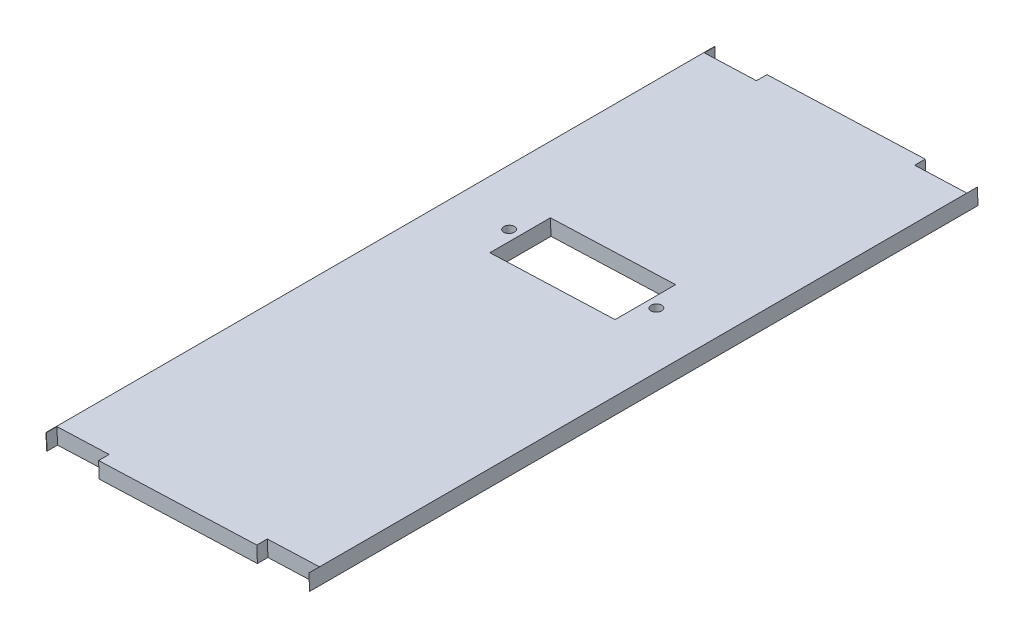
ISO-10303-21;
HEADER;
FILE_DESCRIPTION(('STEP AP214'),'2;1');
FILE_NAME('part.step','',(''),(''),'','','');
FILE_SCHEMA(('AUTOMOTIVE_DESIGN { 1 0 10303 214 1 1 1 1 }'));
ENDSEC;
DATA;
#1=APPLICATION_CONTEXT('core data for automotive mechanical design processes');
#2=APPLICATION_PROTOCOL_DEFINITION('international standard','automotive_design',2000,#1);
#3=PRODUCT_CONTEXT('',#1,'mechanical');
#4=PRODUCT('Part','Part','',(#3));
#5=PRODUCT_RELATED_PRODUCT_CATEGORY('part','',(#4));
#6=PRODUCT_DEFINITION_FORMATION('','',#4);
#7=PRODUCT_DEFINITION_CONTEXT('part definition',#1,'design');
#8=PRODUCT_DEFINITION('design','',#6,#7);
#9=PRODUCT_DEFINITION_SHAPE('','',#8);
#10=(LENGTH_UNIT() NAMED_UNIT(*) SI_UNIT(.MILLI.,.METRE.));
#11=(NAMED_UNIT(*) PLANE_ANGLE_UNIT() SI_UNIT($,.RADIAN.));
#12=(NAMED_UNIT(*) SI_UNIT($,.STERADIAN.) SOLID_ANGLE_UNIT());
#13=UNCERTAINTY_MEASURE_WITH_UNIT(LENGTH_MEASURE(1.E-05),#10,'distance_accuracy_value','');
#14=(GEOMETRIC_REPRESENTATION_CONTEXT(3) GLOBAL_UNCERTAINTY_ASSIGNED_CONTEXT((#13)) GLOBAL_UNIT_ASSIGNED_CONTEXT((#10,
#11,#12)) REPRESENTATION_CONTEXT('',''));
#15=CARTESIAN_POINT('',(0.,0.,0.));
#16=DIRECTION('',(0.,0.,1.));
#17=DIRECTION('',(1.,0.,0.));
#18=AXIS2_PLACEMENT_3D('',#15,#16,#17);
#19=CARTESIAN_POINT('',(0.,0.,889.01));
#20=DIRECTION('',(0.,0.,-1.));
#21=DIRECTION('',(-1.,0.,0.));
#22=AXIS2_PLACEMENT_3D('',#19,#20,#21);
#23=PLANE('',#22);
#24=DIRECTION('',(0.0396321778122835,-0.999214336607445,0.));
#25=VECTOR('',#24,1.);
#26=CARTESIAN_POINT('',(21.3702580239421,-5.63989004149993,889.01));
#27=LINE('',#26,#25);
#28=CARTESIAN_POINT('',(21.3702580239434,-5.63989004149988,889.01));
#29=VERTEX_POINT('',#28);
#30=CARTESIAN_POINT('',(21.4891545573789,-8.63753305132227,889.01));
#31=VERTEX_POINT('',#30);
#32=EDGE_CURVE('E288',#29,#31,#27,.T.);
#33=ORIENTED_EDGE('',*,*,#32,.F.);
#34=DIRECTION('',(0.0373407916957706,-0.999302589447027,0.));
#35=VECTOR('',#34,1.);
#36=CARTESIAN_POINT('',(21.1300096451223,0.789561937515584,889.01));
#37=LINE('',#36,#35);
#38=CARTESIAN_POINT('',(21.4822801045105,-8.63778992798334,889.01));
#39=VERTEX_POINT('',#38);
#40=EDGE_CURVE('E345',#29,#39,#37,.T.);
#41=ORIENTED_EDGE('',*,*,#40,.T.);
#42=DIRECTION('',(-0.999302589447027,-0.0373407916957706,0.));
#43=VECTOR('',#42,1.);
#44=CARTESIAN_POINT('',(21.4891545573789,-8.63753305132227,889.01));
#45=LINE('',#44,#43);
#46=EDGE_CURVE('E293',#31,#39,#45,.T.);
#47=ORIENTED_EDGE('',*,*,#46,.F.);
#48=EDGE_LOOP('',(#33,#41,#47));
#49=FACE_BOUND('',#48,.T.);
#50=ADVANCED_FACE('F41',(#49),#23,.F.);
#51=CARTESIAN_POINT('',(11.5711987882457,-9.00813583403696,889.01));
#52=VERTEX_POINT('',#51);
#53=CARTESIAN_POINT('',(-18.4898234733706,-10.1314215958142,889.01));
#54=VERTEX_POINT('',#53);
#55=EDGE_CURVE('E297',#52,#54,#45,.T.);
#56=ORIENTED_EDGE('',*,*,#55,.F.);
#57=DIRECTION('',(-0.0373407916957706,0.999302589447027,0.));
#58=VECTOR('',#57,1.);
#59=CARTESIAN_POINT('',(11.2189283288575,0.419216031461964,889.01));
#60=LINE('',#59,#58);
#61=CARTESIAN_POINT('',(11.4591767076786,-6.0102359475535,889.01));
#62=VERTEX_POINT('',#61);
#63=EDGE_CURVE('E342',#52,#62,#60,.T.);
#64=ORIENTED_EDGE('',*,*,#63,.T.);
#65=DIRECTION('',(0.999302589447027,0.0373407916957706,0.));
#66=VECTOR('',#65,1.);
#67=CARTESIAN_POINT('',(21.3702580239421,-5.63989004149993,889.01));
#68=LINE('',#67,#66);
#69=CARTESIAN_POINT('',(-18.6018455539377,-7.13352170933071,889.01));
#70=VERTEX_POINT('',#69);
#71=EDGE_CURVE('E300',#70,#62,#68,.T.);
#72=ORIENTED_EDGE('',*,*,#71,.F.);
#73=DIRECTION('',(0.0373407916957706,-0.999302589447027,0.));
#74=VECTOR('',#73,1.);
#75=CARTESIAN_POINT('',(-18.8420939327588,-0.70406973031524,889.01));
#76=LINE('',#75,#74);
#77=EDGE_CURVE('E339',#70,#54,#76,.T.);
#78=ORIENTED_EDGE('',*,*,#77,.T.);
#79=EDGE_LOOP('',(#56,#64,#72,#78));
#80=FACE_BOUND('',#79,.T.);
#81=ADVANCED_FACE('F406',(#80),#23,.F.);
#82=CARTESIAN_POINT('',(0.,0.,762.01));
#83=DIRECTION('',(0.,0.,-1.));
#84=DIRECTION('',(-1.,0.,0.));
#85=AXIS2_PLACEMENT_3D('',#82,#83,#84);
#86=PLANE('',#85);
#87=DIRECTION('',(0.0373407916957706,-0.999302589447027,0.));
#88=VECTOR('',#87,1.);
#89=CARTESIAN_POINT('',(-18.8420939327601,-0.704069730315288,762.01));
#90=LINE('',#89,#88);
#91=CARTESIAN_POINT('',(-18.601845553939,-7.13352170933076,762.01));
#92=VERTEX_POINT('',#91);
#93=CARTESIAN_POINT('',(-18.4898234733719,-10.1314215958142,762.01));
#94=VERTEX_POINT('',#93);
#95=EDGE_CURVE('E334',#92,#94,#90,.T.);
#96=ORIENTED_EDGE('',*,*,#95,.F.);
#97=DIRECTION('',(0.999302589447027,0.0373407916957706,0.));
#98=VECTOR('',#97,1.);
#99=CARTESIAN_POINT('',(21.3702580239421,-5.63989004149993,762.01));
#100=LINE('',#99,#98);
#101=CARTESIAN_POINT('',(11.4591767076773,-6.01023594755355,762.01));
#102=VERTEX_POINT('',#101);
#103=EDGE_CURVE('E315',#92,#102,#100,.T.);
#104=ORIENTED_EDGE('',*,*,#103,.T.);
#105=DIRECTION('',(-0.0373407916957706,0.999302589447027,0.));
#106=VECTOR('',#105,1.);
#107=CARTESIAN_POINT('',(11.2189283288562,0.419216031461915,762.01));
#108=LINE('',#107,#106);
#109=CARTESIAN_POINT('',(11.5711987882444,-9.00813583403701,762.01));
#110=VERTEX_POINT('',#109);
#111=EDGE_CURVE('E321',#110,#102,#108,.T.);
#112=ORIENTED_EDGE('',*,*,#111,.F.);
#113=DIRECTION('',(-0.999302589447027,-0.0373407916957706,0.));
#114=VECTOR('',#113,1.);
#115=CARTESIAN_POINT('',(21.4891545573789,-8.63753305132227,762.01));
#116=LINE('',#115,#114);
#117=EDGE_CURVE('E312',#110,#94,#116,.T.);
#118=ORIENTED_EDGE('',*,*,#117,.T.);
#119=EDGE_LOOP('',(#96,#104,#112,#118));
#120=FACE_BOUND('',#119,.T.);
#121=ADVANCED_FACE('F431',(#120),#86,.T.);
#122=DIRECTION('',(0.0373407916957706,-0.999302589447027,0.));
#123=VECTOR('',#122,1.);
#124=CARTESIAN_POINT('',(21.130009645121,0.789561937515535,762.01));
#125=LINE('',#124,#123);
#126=CARTESIAN_POINT('',(21.3702580239421,-5.63989004149993,762.01));
#127=VERTEX_POINT('',#126);
#128=CARTESIAN_POINT('',(21.4822801045092,-8.63778992798339,762.01));
#129=VERTEX_POINT('',#128);
#130=EDGE_CURVE('E330',#127,#129,#125,.T.);
#131=ORIENTED_EDGE('',*,*,#130,.F.);
#132=DIRECTION('',(0.0396321778122835,-0.999214336607445,0.));
#133=VECTOR('',#132,1.);
#134=CARTESIAN_POINT('',(21.3702580239421,-5.63989004149993,762.01));
#135=LINE('',#134,#133);
#136=CARTESIAN_POINT('',(21.4891545573789,-8.63753305132227,762.01));
#137=VERTEX_POINT('',#136);
#138=EDGE_CURVE('E287',#127,#137,#135,.T.);
#139=ORIENTED_EDGE('',*,*,#138,.T.);
#140=EDGE_CURVE('E308',#137,#129,#116,.T.);
#141=ORIENTED_EDGE('',*,*,#140,.T.);
#142=EDGE_LOOP('',(#131,#139,#141));
#143=FACE_BOUND('',#142,.T.);
#144=ADVANCED_FACE('F457',(#143),#86,.T.);
#145=CARTESIAN_POINT('',(21.3702580239421,-5.63989004149993,889.01));
#146=DIRECTION('',(0.999214336607445,0.0396321778122835,0.));
#147=DIRECTION('',(-0.0396321778122835,0.999214336607445,0.));
#148=AXIS2_PLACEMENT_3D('',#145,#146,#147);
#149=PLANE('',#148);
#150=ORIENTED_EDGE('',*,*,#138,.F.);
#151=DIRECTION('',(0.,0.,-1.));
#152=VECTOR('',#151,1.);
#153=CARTESIAN_POINT('',(21.3702580239421,-5.63989004149993,762.01));
#154=LINE('',#153,#152);
#155=CARTESIAN_POINT('',(21.3702580239421,-5.63989004149993,764.01));
#156=VERTEX_POINT('',#155);
#157=EDGE_CURVE('E239',#156,#127,#154,.T.);
#158=ORIENTED_EDGE('',*,*,#157,.F.);
#159=DIRECTION('',(0.,0.,-1.));
#160=VECTOR('',#159,1.);
#161=CARTESIAN_POINT('',(21.3702580239421,-5.63989004149993,889.01));
#162=LINE('',#161,#160);
#163=CARTESIAN_POINT('',(21.3702580239432,-5.63989004149989,887.01));
#164=VERTEX_POINT('',#163);
#165=EDGE_CURVE('E322',#164,#156,#162,.T.);
#166=ORIENTED_EDGE('',*,*,#165,.F.);
#167=EDGE_CURVE('E318',#29,#164,#162,.T.);
#168=ORIENTED_EDGE('',*,*,#167,.F.);
#169=ORIENTED_EDGE('',*,*,#32,.T.);
#170=DIRECTION('',(0.,0.,-1.));
#171=VECTOR('',#170,1.);
#172=CARTESIAN_POINT('',(21.4891545573789,-8.63753305132227,889.01));
#173=LINE('',#172,#171);
#174=EDGE_CURVE('E304',#31,#137,#173,.T.);
#175=ORIENTED_EDGE('',*,*,#174,.T.);
#176=EDGE_LOOP('',(#150,#158,#166,#168,#169,#175));
#177=FACE_BOUND('',#176,.T.);
#178=ADVANCED_FACE('F43',(#177),#149,.T.);
#179=CARTESIAN_POINT('',(21.3702580239421,-5.63989004149993,889.01));
#180=DIRECTION('',(-0.0373407916957706,0.999302589447027,0.));
#181=DIRECTION('',(-0.999302589447027,-0.0373407916957706,0.));
#182=AXIS2_PLACEMENT_3D('',#179,#180,#181);
#183=PLANE('',#182);
#184=CARTESIAN_POINT('',(-17.602542964492,-7.09618091763499,812.01));
#185=DIRECTION('',(-0.0373407916957706,0.999302589447027,0.));
#186=DIRECTION('',(0.999302589447027,0.0373407916957706,0.));
#187=AXIS2_PLACEMENT_3D('',#184,#185,#186);
#188=CIRCLE('',#187,1.00000000000001);
#189=CARTESIAN_POINT('',(-16.6032403750449,-7.05884012593921,812.01));
#190=VERTEX_POINT('',#189);
#191=EDGE_CURVE('E666',#190,#190,#188,.T.);
#192=ORIENTED_EDGE('',*,*,#191,.F.);
#193=EDGE_LOOP('',(#192));
#194=FACE_BOUND('',#193,.T.);
#195=CARTESIAN_POINT('',(10.3779295400248,-6.05063875015341,812.01));
#196=DIRECTION('',(-0.0373407916957706,0.999302589447027,0.));
#197=DIRECTION('',(-0.999302589447027,-0.0373407916957706,0.));
#198=AXIS2_PLACEMENT_3D('',#195,#196,#197);
#199=CIRCLE('',#198,1.);
#200=CARTESIAN_POINT('',(9.37862695057775,-6.08797954184918,812.01));
#201=VERTEX_POINT('',#200);
#202=EDGE_CURVE('E664',#201,#201,#199,.T.);
#203=ORIENTED_EDGE('',*,*,#202,.F.);
#204=EDGE_LOOP('',(#203));
#205=FACE_BOUND('',#204,.T.);
#206=DIRECTION('',(0.,0.,-1.));
#207=VECTOR('',#206,1.);
#208=CARTESIAN_POINT('',(8.27939410218603,-6.12905441271453,806.26));
#209=LINE('',#208,#207);
#210=CARTESIAN_POINT('',(8.27939410218603,-6.12905441271453,817.76));
#211=VERTEX_POINT('',#210);
#212=CARTESIAN_POINT('',(8.27939410218601,-6.12905441271453,806.26));
#213=VERTEX_POINT('',#212);
#214=EDGE_CURVE('E58',#211,#213,#209,.T.);
#215=ORIENTED_EDGE('',*,*,#214,.F.);
#216=DIRECTION('',(0.999302589447027,0.0373407916957706,0.));
#217=VECTOR('',#216,1.);
#218=CARTESIAN_POINT('',(-15.5040075266532,-7.01776525507387,817.76));
#219=LINE('',#218,#217);
#220=CARTESIAN_POINT('',(-15.5040075266532,-7.01776525507387,817.76));
#221=VERTEX_POINT('',#220);
#222=EDGE_CURVE('E216',#221,#211,#219,.T.);
#223=ORIENTED_EDGE('',*,*,#222,.F.);
#224=DIRECTION('',(0.,0.,1.));
#225=VECTOR('',#224,1.);
#226=CARTESIAN_POINT('',(-15.5040075266532,-7.01776525507387,806.26));
#227=LINE('',#226,#225);
#228=CARTESIAN_POINT('',(-15.5040075266532,-7.01776525507387,806.26));
#229=VERTEX_POINT('',#228);
#230=EDGE_CURVE('E200',#229,#221,#227,.T.);
#231=ORIENTED_EDGE('',*,*,#230,.F.);
#232=DIRECTION('',(-0.999302589447027,-0.0373407916957706,0.));
#233=VECTOR('',#232,1.);
#234=CARTESIAN_POINT('',(-15.5040075266532,-7.01776525507387,806.26));
#235=LINE('',#234,#233);
#236=EDGE_CURVE('E209',#213,#229,#235,.T.);
#237=ORIENTED_EDGE('',*,*,#236,.F.);
#238=EDGE_LOOP('',(#215,#223,#231,#237));
#239=FACE_BOUND('',#238,.T.);
#240=DIRECTION('',(0.,0.,1.));
#241=VECTOR('',#240,1.);
#242=CARTESIAN_POINT('',(11.4591767076786,-6.0102359475535,887.01));
#243=LINE('',#242,#241);
#244=CARTESIAN_POINT('',(11.4591767076786,-6.0102359475535,887.01));
#245=VERTEX_POINT('',#244);
#246=EDGE_CURVE('E254',#245,#62,#243,.T.);
#247=ORIENTED_EDGE('',*,*,#246,.F.);
#248=DIRECTION('',(-0.999302589447027,-0.0373407916957705,0.));
#249=VECTOR('',#248,1.);
#250=CARTESIAN_POINT('',(21.3702580239432,-5.63989004149989,887.01));
#251=LINE('',#250,#249);
#252=EDGE_CURVE('E245',#164,#245,#251,.T.);
#253=ORIENTED_EDGE('',*,*,#252,.F.);
#254=ORIENTED_EDGE('',*,*,#165,.T.);
#255=DIRECTION('',(0.999302589447027,0.0373407916957705,0.));
#256=VECTOR('',#255,1.);
#257=CARTESIAN_POINT('',(21.3702580239421,-5.63989004149993,764.01));
#258=LINE('',#257,#256);
#259=CARTESIAN_POINT('',(11.4591767076773,-6.01023594755355,764.01));
#260=VERTEX_POINT('',#259);
#261=EDGE_CURVE('E264',#260,#156,#258,.T.);
#262=ORIENTED_EDGE('',*,*,#261,.F.);
#263=DIRECTION('',(0.,0.,1.));
#264=VECTOR('',#263,1.);
#265=CARTESIAN_POINT('',(11.4591767076773,-6.01023594755355,762.01));
#266=LINE('',#265,#264);
#267=EDGE_CURVE('E261',#102,#260,#266,.T.);
#268=ORIENTED_EDGE('',*,*,#267,.F.);
#269=ORIENTED_EDGE('',*,*,#103,.F.);
#270=DIRECTION('',(0.,0.,-1.));
#271=VECTOR('',#270,1.);
#272=CARTESIAN_POINT('',(-18.601845553939,-7.13352170933076,762.01));
#273=LINE('',#272,#271);
#274=CARTESIAN_POINT('',(-18.601845553939,-7.13352170933076,764.01));
#275=VERTEX_POINT('',#274);
#276=EDGE_CURVE('E237',#275,#92,#273,.T.);
#277=ORIENTED_EDGE('',*,*,#276,.F.);
#278=DIRECTION('',(0.999302589447027,0.0373407916957706,0.));
#279=VECTOR('',#278,1.);
#280=CARTESIAN_POINT('',(-18.601845553939,-7.13352170933076,764.01));
#281=LINE('',#280,#279);
#282=CARTESIAN_POINT('',(-28.5129268702038,-7.50386761538438,764.01));
#283=VERTEX_POINT('',#282);
#284=EDGE_CURVE('E228',#283,#275,#281,.T.);
#285=ORIENTED_EDGE('',*,*,#284,.F.);
#286=DIRECTION('',(0.,0.,1.));
#287=VECTOR('',#286,1.);
#288=CARTESIAN_POINT('',(-28.5129268702038,-7.50386761538438,762.01));
#289=LINE('',#288,#287);
#290=CARTESIAN_POINT('',(-28.5129268702038,-7.50386761538438,762.01));
#291=VERTEX_POINT('',#290);
#292=EDGE_CURVE('E234',#291,#283,#289,.T.);
#293=ORIENTED_EDGE('',*,*,#292,.F.);
#294=CARTESIAN_POINT('',(-28.5948714484093,-7.50692962628846,762.01));
#295=VERTEX_POINT('',#294);
#296=EDGE_CURVE('E292',#295,#291,#100,.T.);
#297=ORIENTED_EDGE('',*,*,#296,.F.);
#298=DIRECTION('',(0.,0.,-1.));
#299=VECTOR('',#298,1.);
#300=CARTESIAN_POINT('',(-28.5948714484093,-7.50692962628846,889.01));
#301=LINE('',#300,#299);
#302=CARTESIAN_POINT('',(-28.5948714484093,-7.50692962628846,889.01));
#303=VERTEX_POINT('',#302);
#304=EDGE_CURVE('E323',#303,#295,#301,.T.);
#305=ORIENTED_EDGE('',*,*,#304,.F.);
#306=CARTESIAN_POINT('',(-28.5129268702025,-7.50386761538433,889.01));
#307=VERTEX_POINT('',#306);
#308=EDGE_CURVE('E301',#303,#307,#68,.T.);
#309=ORIENTED_EDGE('',*,*,#308,.T.);
#310=DIRECTION('',(0.,0.,1.));
#311=VECTOR('',#310,1.);
#312=CARTESIAN_POINT('',(-28.5129268702025,-7.50386761538433,887.01));
#313=LINE('',#312,#311);
#314=CARTESIAN_POINT('',(-28.5129268702025,-7.50386761538433,887.01));
#315=VERTEX_POINT('',#314);
#316=EDGE_CURVE('E242',#315,#307,#313,.T.);
#317=ORIENTED_EDGE('',*,*,#316,.F.);
#318=DIRECTION('',(-0.999302589447027,-0.0373407916957706,0.));
#319=VECTOR('',#318,1.);
#320=CARTESIAN_POINT('',(-18.6018455539379,-7.13352170933071,887.01));
#321=LINE('',#320,#319);
#322=CARTESIAN_POINT('',(-18.6018455539379,-7.13352170933071,887.01));
#323=VERTEX_POINT('',#322);
#324=EDGE_CURVE('E247',#323,#315,#321,.T.);
#325=ORIENTED_EDGE('',*,*,#324,.F.);
#326=DIRECTION('',(0.,0.,-1.));
#327=VECTOR('',#326,1.);
#328=CARTESIAN_POINT('',(-18.6018455539379,-7.13352170933071,887.01));
#329=LINE('',#328,#327);
#330=EDGE_CURVE('E231',#70,#323,#329,.T.);
#331=ORIENTED_EDGE('',*,*,#330,.F.);
#332=ORIENTED_EDGE('',*,*,#71,.T.);
#333=EDGE_LOOP('',(#247,#253,#254,#262,#268,#269,#277,#285,#293,#297,#305,#309,#317,#325,#331,#332));
#334=FACE_BOUND('',#333,.T.);
#335=ADVANCED_FACE('F213',(#194,#205,#239,#334),#183,.T.);
#336=CARTESIAN_POINT('',(-28.5948714484093,-7.50692962628846,889.01));
#337=DIRECTION('',(-0.999214336607445,-0.0396321778122847,0.));
#338=DIRECTION('',(0.0396321778122847,-0.999214336607445,0.));
#339=AXIS2_PLACEMENT_3D('',#336,#337,#338);
#340=PLANE('',#339);
#341=DIRECTION('',(-0.0396321778122847,0.999214336607445,0.));
#342=VECTOR('',#341,1.);
#343=CARTESIAN_POINT('',(-28.5948714484093,-7.50692962628846,762.01));
#344=LINE('',#343,#342);
#345=CARTESIAN_POINT('',(-28.4759749149724,-10.5045726361108,762.01));
#346=VERTEX_POINT('',#345);
#347=EDGE_CURVE('E311',#346,#295,#344,.T.);
#348=ORIENTED_EDGE('',*,*,#347,.F.);
#349=DIRECTION('',(0.,0.,-1.));
#350=VECTOR('',#349,1.);
#351=CARTESIAN_POINT('',(-28.4759749149724,-10.5045726361108,889.01));
#352=LINE('',#351,#350);
#353=CARTESIAN_POINT('',(-28.4759749149724,-10.5045726361108,889.01));
#354=VERTEX_POINT('',#353);
#355=EDGE_CURVE('E325',#354,#346,#352,.T.);
#356=ORIENTED_EDGE('',*,*,#355,.F.);
#357=DIRECTION('',(-0.0396321778122847,0.999214336607445,0.));
#358=VECTOR('',#357,1.);
#359=CARTESIAN_POINT('',(-28.5948714484093,-7.50692962628846,889.01));
#360=LINE('',#359,#358);
#361=EDGE_CURVE('E296',#354,#303,#360,.T.);
#362=ORIENTED_EDGE('',*,*,#361,.T.);
#363=ORIENTED_EDGE('',*,*,#304,.T.);
#364=EDGE_LOOP('',(#348,#356,#362,#363));
#365=FACE_BOUND('',#364,.T.);
#366=ADVANCED_FACE('F372',(#365),#340,.T.);
#367=CARTESIAN_POINT('',(21.4891545573789,-8.63753305132227,889.01));
#368=DIRECTION('',(0.0373407916957706,-0.999302589447027,0.));
#369=DIRECTION('',(0.999302589447027,0.0373407916957706,0.));
#370=AXIS2_PLACEMENT_3D('',#367,#368,#369);
#371=PLANE('',#370);
#372=CARTESIAN_POINT('',(-17.4905208839249,-10.0940808041184,812.01));
#373=DIRECTION('',(0.0373407916957706,-0.999302589447027,0.));
#374=DIRECTION('',(0.999302589447027,0.0373407916957706,0.));
#375=AXIS2_PLACEMENT_3D('',#372,#373,#374);
#376=CIRCLE('',#375,1.00000000000001);
#377=CARTESIAN_POINT('',(-16.4912182944778,-10.0567400124227,812.01));
#378=VERTEX_POINT('',#377);
#379=EDGE_CURVE('E45',#378,#378,#376,.T.);
#380=ORIENTED_EDGE('',*,*,#379,.F.);
#381=EDGE_LOOP('',(#380));
#382=FACE_BOUND('',#381,.T.);
#383=CARTESIAN_POINT('',(10.4899516205919,-9.04853863663687,812.01));
#384=DIRECTION('',(0.0373407916957706,-0.999302589447027,0.));
#385=DIRECTION('',(0.999302589447027,0.0373407916957706,0.));
#386=AXIS2_PLACEMENT_3D('',#383,#384,#385);
#387=CIRCLE('',#386,1.);
#388=CARTESIAN_POINT('',(11.4892542100389,-9.0111978449411,812.01));
#389=VERTEX_POINT('',#388);
#390=EDGE_CURVE('E223',#389,#389,#387,.T.);
#391=ORIENTED_EDGE('',*,*,#390,.F.);
#392=EDGE_LOOP('',(#391));
#393=FACE_BOUND('',#392,.T.);
#394=DIRECTION('',(0.,0.,1.));
#395=VECTOR('',#394,1.);
#396=CARTESIAN_POINT('',(8.39141618275315,-9.12695429919799,889.01));
#397=LINE('',#396,#395);
#398=CARTESIAN_POINT('',(8.39141618275313,-9.12695429919799,806.26));
#399=VERTEX_POINT('',#398);
#400=CARTESIAN_POINT('',(8.39141618275313,-9.12695429919799,817.76));
#401=VERTEX_POINT('',#400);
#402=EDGE_CURVE('E11',#399,#401,#397,.T.);
#403=ORIENTED_EDGE('',*,*,#402,.F.);
#404=DIRECTION('',(0.999302589447027,0.0373407916957706,0.));
#405=VECTOR('',#404,1.);
#406=CARTESIAN_POINT('',(21.4891545573789,-8.63753305132227,806.26));
#407=LINE('',#406,#405);
#408=CARTESIAN_POINT('',(-15.3919854460861,-10.0156651415573,806.26));
#409=VERTEX_POINT('',#408);
#410=EDGE_CURVE('E356',#409,#399,#407,.T.);
#411=ORIENTED_EDGE('',*,*,#410,.F.);
#412=DIRECTION('',(0.,0.,-1.));
#413=VECTOR('',#412,1.);
#414=CARTESIAN_POINT('',(-15.3919854460861,-10.0156651415573,889.01));
#415=LINE('',#414,#413);
#416=CARTESIAN_POINT('',(-15.3919854460861,-10.0156651415573,817.76));
#417=VERTEX_POINT('',#416);
#418=EDGE_CURVE('E203',#417,#409,#415,.T.);
#419=ORIENTED_EDGE('',*,*,#418,.F.);
#420=DIRECTION('',(-0.999302589447027,-0.0373407916957706,0.));
#421=VECTOR('',#420,1.);
#422=CARTESIAN_POINT('',(21.4891545573789,-8.63753305132227,817.76));
#423=LINE('',#422,#421);
#424=EDGE_CURVE('E50',#401,#417,#423,.T.);
#425=ORIENTED_EDGE('',*,*,#424,.F.);
#426=EDGE_LOOP('',(#403,#411,#419,#425));
#427=FACE_BOUND('',#426,.T.);
#428=DIRECTION('',(0.,0.,1.));
#429=VECTOR('',#428,1.);
#430=CARTESIAN_POINT('',(21.4822801045105,-8.63778992798334,889.01));
#431=LINE('',#430,#429);
#432=CARTESIAN_POINT('',(21.4822801045103,-8.63778992798335,887.01));
#433=VERTEX_POINT('',#432);
#434=EDGE_CURVE('E285',#433,#39,#431,.T.);
#435=ORIENTED_EDGE('',*,*,#434,.F.);
#436=DIRECTION('',(0.999302589447027,0.0373407916957706,0.));
#437=VECTOR('',#436,1.);
#438=CARTESIAN_POINT('',(21.4891545573789,-8.63753305132227,887.01));
#439=LINE('',#438,#437);
#440=CARTESIAN_POINT('',(11.5711987882457,-9.00813583403696,887.01));
#441=VERTEX_POINT('',#440);
#442=EDGE_CURVE('E354',#441,#433,#439,.T.);
#443=ORIENTED_EDGE('',*,*,#442,.F.);
#444=DIRECTION('',(0.,0.,-1.));
#445=VECTOR('',#444,1.);
#446=CARTESIAN_POINT('',(11.5711987882457,-9.00813583403696,889.01));
#447=LINE('',#446,#445);
#448=EDGE_CURVE('E283',#52,#441,#447,.T.);
#449=ORIENTED_EDGE('',*,*,#448,.F.);
#450=ORIENTED_EDGE('',*,*,#55,.T.);
#451=DIRECTION('',(0.,0.,1.));
#452=VECTOR('',#451,1.);
#453=CARTESIAN_POINT('',(-18.4898234733706,-10.1314215958142,889.010000000004));
#454=LINE('',#453,#452);
#455=CARTESIAN_POINT('',(-18.4898234733708,-10.1314215958142,887.01));
#456=VERTEX_POINT('',#455);
#457=EDGE_CURVE('E281',#456,#54,#454,.T.);
#458=ORIENTED_EDGE('',*,*,#457,.F.);
#459=DIRECTION('',(0.999302589447027,0.0373407916957706,0.));
#460=VECTOR('',#459,1.);
#461=CARTESIAN_POINT('',(21.4891545573789,-8.63753305132227,887.01));
#462=LINE('',#461,#460);
#463=CARTESIAN_POINT('',(-28.4009047896354,-10.5017675018678,887.01));
#464=VERTEX_POINT('',#463);
#465=EDGE_CURVE('E352',#464,#456,#462,.T.);
#466=ORIENTED_EDGE('',*,*,#465,.F.);
#467=DIRECTION('',(0.,0.,-1.));
#468=VECTOR('',#467,1.);
#469=CARTESIAN_POINT('',(-28.4009047896354,-10.5017675018678,889.01));
#470=LINE('',#469,#468);
#471=CARTESIAN_POINT('',(-28.4009047896354,-10.5017675018678,889.01));
#472=VERTEX_POINT('',#471);
#473=EDGE_CURVE('E279',#472,#464,#470,.T.);
#474=ORIENTED_EDGE('',*,*,#473,.F.);
#475=EDGE_CURVE('E291',#472,#354,#45,.T.);
#476=ORIENTED_EDGE('',*,*,#475,.T.);
#477=ORIENTED_EDGE('',*,*,#355,.T.);
#478=CARTESIAN_POINT('',(-28.4009047896367,-10.5017675018678,762.01));
#479=VERTEX_POINT('',#478);
#480=EDGE_CURVE('E307',#479,#346,#116,.T.);
#481=ORIENTED_EDGE('',*,*,#480,.F.);
#482=DIRECTION('',(0.,0.,-1.));
#483=VECTOR('',#482,1.);
#484=CARTESIAN_POINT('',(-28.4009047896367,-10.5017675018678,889.01));
#485=LINE('',#484,#483);
#486=CARTESIAN_POINT('',(-28.4009047896367,-10.5017675018678,764.01));
#487=VERTEX_POINT('',#486);
#488=EDGE_CURVE('E275',#487,#479,#485,.T.);
#489=ORIENTED_EDGE('',*,*,#488,.F.);
#490=DIRECTION('',(-0.999302589447027,-0.0373407916957706,0.));
#491=VECTOR('',#490,1.);
#492=CARTESIAN_POINT('',(21.4891545573789,-8.63753305132227,764.01));
#493=LINE('',#492,#491);
#494=CARTESIAN_POINT('',(-18.4898234733719,-10.1314215958142,764.01));
#495=VERTEX_POINT('',#494);
#496=EDGE_CURVE('E350',#495,#487,#493,.T.);
#497=ORIENTED_EDGE('',*,*,#496,.F.);
#498=DIRECTION('',(0.,0.,1.));
#499=VECTOR('',#498,1.);
#500=CARTESIAN_POINT('',(-18.4898234733719,-10.1314215958142,889.01));
#501=LINE('',#500,#499);
#502=EDGE_CURVE('E277',#94,#495,#501,.T.);
#503=ORIENTED_EDGE('',*,*,#502,.F.);
#504=ORIENTED_EDGE('',*,*,#117,.F.);
#505=DIRECTION('',(0.,0.,-1.));
#506=VECTOR('',#505,1.);
#507=CARTESIAN_POINT('',(11.5711987882444,-9.00813583403701,889.01));
#508=LINE('',#507,#506);
#509=CARTESIAN_POINT('',(11.5711987882444,-9.00813583403701,764.01));
#510=VERTEX_POINT('',#509);
#511=EDGE_CURVE('E270',#510,#110,#508,.T.);
#512=ORIENTED_EDGE('',*,*,#511,.F.);
#513=DIRECTION('',(-0.999302589447027,-0.0373407916957706,0.));
#514=VECTOR('',#513,1.);
#515=CARTESIAN_POINT('',(21.4891545573789,-8.63753305132227,764.01));
#516=LINE('',#515,#514);
#517=CARTESIAN_POINT('',(21.4822801045092,-8.63778992798339,764.01));
#518=VERTEX_POINT('',#517);
#519=EDGE_CURVE('E348',#518,#510,#516,.T.);
#520=ORIENTED_EDGE('',*,*,#519,.F.);
#521=DIRECTION('',(0.,0.,1.));
#522=VECTOR('',#521,1.);
#523=CARTESIAN_POINT('',(21.4822801045092,-8.63778992798339,889.01));
#524=LINE('',#523,#522);
#525=EDGE_CURVE('E273',#129,#518,#524,.T.);
#526=ORIENTED_EDGE('',*,*,#525,.F.);
#527=ORIENTED_EDGE('',*,*,#140,.F.);
#528=ORIENTED_EDGE('',*,*,#174,.F.);
#529=ORIENTED_EDGE('',*,*,#46,.T.);
#530=EDGE_LOOP('',(#435,#443,#449,#450,#458,#466,#474,#476,#477,#481,#489,#497,#503,#504,#512,
#520,#526,#527,#528,#529));
#531=FACE_BOUND('',#530,.T.);
#532=ADVANCED_FACE('F368',(#382,#393,#427,#531),#371,.T.);
#533=ORIENTED_EDGE('',*,*,#475,.F.);
#534=DIRECTION('',(-0.0373407916957706,0.999302589447027,0.));
#535=VECTOR('',#534,1.);
#536=CARTESIAN_POINT('',(-28.7531752490236,-1.07441563636886,889.01));
#537=LINE('',#536,#535);
#538=EDGE_CURVE('E336',#472,#307,#537,.T.);
#539=ORIENTED_EDGE('',*,*,#538,.T.);
#540=ORIENTED_EDGE('',*,*,#308,.F.);
#541=ORIENTED_EDGE('',*,*,#361,.F.);
#542=EDGE_LOOP('',(#533,#539,#540,#541));
#543=FACE_BOUND('',#542,.T.);
#544=ADVANCED_FACE('F371',(#543),#23,.F.);
#545=DIRECTION('',(-0.0373407916957706,0.999302589447027,0.));
#546=VECTOR('',#545,1.);
#547=CARTESIAN_POINT('',(-28.7531752490249,-1.07441563636891,762.01));
#548=LINE('',#547,#546);
#549=EDGE_CURVE('E332',#479,#291,#548,.T.);
#550=ORIENTED_EDGE('',*,*,#549,.F.);
#551=ORIENTED_EDGE('',*,*,#480,.T.);
#552=ORIENTED_EDGE('',*,*,#347,.T.);
#553=ORIENTED_EDGE('',*,*,#296,.T.);
#554=EDGE_LOOP('',(#550,#551,#552,#553));
#555=FACE_BOUND('',#554,.T.);
#556=ADVANCED_FACE('F424',(#555),#86,.T.);
#557=CARTESIAN_POINT('',(21.551948219545,-10.5022262346469,762.01));
#558=DIRECTION('',(0.999302589447027,0.0373407916957706,0.));
#559=DIRECTION('',(-0.0373407916957706,0.999302589447027,0.));
#560=AXIS2_PLACEMENT_3D('',#557,#558,#559);
#561=PLANE('',#560);
#562=ORIENTED_EDGE('',*,*,#525,.T.);
#563=DIRECTION('',(-0.0373407916957706,0.999302589447027,0.));
#564=VECTOR('',#563,1.);
#565=CARTESIAN_POINT('',(21.551948219545,-10.5022262346469,764.01));
#566=LINE('',#565,#564);
#567=EDGE_CURVE('E268',#518,#156,#566,.T.);
#568=ORIENTED_EDGE('',*,*,#567,.T.);
#569=ORIENTED_EDGE('',*,*,#157,.T.);
#570=ORIENTED_EDGE('',*,*,#130,.T.);
#571=EDGE_LOOP('',(#562,#568,#569,#570));
#572=FACE_BOUND('',#571,.T.);
#573=ADVANCED_FACE('F458',(#572),#561,.F.);
#574=CARTESIAN_POINT('',(21.551948219545,-10.5022262346469,764.01));
#575=DIRECTION('',(0.,0.,1.));
#576=DIRECTION('',(1.,0.,0.));
#577=AXIS2_PLACEMENT_3D('',#574,#575,#576);
#578=PLANE('',#577);
#579=ORIENTED_EDGE('',*,*,#519,.T.);
#580=DIRECTION('',(-0.0373407916957706,0.999302589447027,0.));
#581=VECTOR('',#580,1.);
#582=CARTESIAN_POINT('',(11.6408669032802,-10.8725721407005,764.01));
#583=LINE('',#582,#581);
#584=EDGE_CURVE('E267',#510,#260,#583,.T.);
#585=ORIENTED_EDGE('',*,*,#584,.T.);
#586=ORIENTED_EDGE('',*,*,#261,.T.);
#587=ORIENTED_EDGE('',*,*,#567,.F.);
#588=EDGE_LOOP('',(#579,#585,#586,#587));
#589=FACE_BOUND('',#588,.T.);
#590=ADVANCED_FACE('F451',(#589),#578,.F.);
#591=CARTESIAN_POINT('',(11.6408669032802,-10.8725721407005,762.01));
#592=DIRECTION('',(-0.999302589447027,-0.0373407916957706,0.));
#593=DIRECTION('',(0.0373407916957706,-0.999302589447027,0.));
#594=AXIS2_PLACEMENT_3D('',#591,#592,#593);
#595=PLANE('',#594);
#596=ORIENTED_EDGE('',*,*,#511,.T.);
#597=ORIENTED_EDGE('',*,*,#111,.T.);
#598=ORIENTED_EDGE('',*,*,#267,.T.);
#599=ORIENTED_EDGE('',*,*,#584,.F.);
#600=EDGE_LOOP('',(#596,#597,#598,#599));
#601=FACE_BOUND('',#600,.T.);
#602=ADVANCED_FACE('F449',(#601),#595,.F.);
#603=CARTESIAN_POINT('',(-18.4201553583361,-11.9958579024777,762.01));
#604=DIRECTION('',(0.999302589447027,0.0373407916957706,0.));
#605=DIRECTION('',(-0.0373407916957706,0.999302589447027,0.));
#606=AXIS2_PLACEMENT_3D('',#603,#604,#605);
#607=PLANE('',#606);
#608=ORIENTED_EDGE('',*,*,#502,.T.);
#609=DIRECTION('',(-0.0373407916957706,0.999302589447027,0.));
#610=VECTOR('',#609,1.);
#611=CARTESIAN_POINT('',(-18.4201553583361,-11.9958579024777,764.01));
#612=LINE('',#611,#610);
#613=EDGE_CURVE('E229',#495,#275,#612,.T.);
#614=ORIENTED_EDGE('',*,*,#613,.T.);
#615=ORIENTED_EDGE('',*,*,#276,.T.);
#616=ORIENTED_EDGE('',*,*,#95,.T.);
#617=EDGE_LOOP('',(#608,#614,#615,#616));
#618=FACE_BOUND('',#617,.T.);
#619=ADVANCED_FACE('F440',(#618),#607,.F.);
#620=CARTESIAN_POINT('',(-18.4201553583361,-11.9958579024777,764.01));
#621=DIRECTION('',(0.,0.,1.));
#622=DIRECTION('',(1.,0.,0.));
#623=AXIS2_PLACEMENT_3D('',#620,#621,#622);
#624=PLANE('',#623);
#625=ORIENTED_EDGE('',*,*,#496,.T.);
#626=DIRECTION('',(-0.0373407916957706,0.999302589447027,0.));
#627=VECTOR('',#626,1.);
#628=CARTESIAN_POINT('',(-28.3312366746009,-12.3662038085313,764.01));
#629=LINE('',#628,#627);
#630=EDGE_CURVE('E226',#487,#283,#629,.T.);
#631=ORIENTED_EDGE('',*,*,#630,.T.);
#632=ORIENTED_EDGE('',*,*,#284,.T.);
#633=ORIENTED_EDGE('',*,*,#613,.F.);
#634=EDGE_LOOP('',(#625,#631,#632,#633));
#635=FACE_BOUND('',#634,.T.);
#636=ADVANCED_FACE('F442',(#635),#624,.F.);
#637=CARTESIAN_POINT('',(-28.3312366746009,-12.3662038085313,762.01));
#638=DIRECTION('',(-0.999302589447027,-0.0373407916957706,0.));
#639=DIRECTION('',(0.0373407916957706,-0.999302589447027,0.));
#640=AXIS2_PLACEMENT_3D('',#637,#638,#639);
#641=PLANE('',#640);
#642=ORIENTED_EDGE('',*,*,#488,.T.);
#643=ORIENTED_EDGE('',*,*,#549,.T.);
#644=ORIENTED_EDGE('',*,*,#292,.T.);
#645=ORIENTED_EDGE('',*,*,#630,.F.);
#646=EDGE_LOOP('',(#642,#643,#644,#645));
#647=FACE_BOUND('',#646,.T.);
#648=ADVANCED_FACE('F542',(#647),#641,.F.);
#649=CARTESIAN_POINT('',(-18.420155358335,-11.9958579024777,887.01));
#650=DIRECTION('',(0.999302589447027,0.0373407916957706,0.));
#651=DIRECTION('',(-0.0373407916957706,0.999302589447027,0.));
#652=AXIS2_PLACEMENT_3D('',#649,#650,#651);
#653=PLANE('',#652);
#654=ORIENTED_EDGE('',*,*,#457,.T.);
#655=ORIENTED_EDGE('',*,*,#77,.F.);
#656=ORIENTED_EDGE('',*,*,#330,.T.);
#657=DIRECTION('',(-0.0373407916957706,0.999302589447027,0.));
#658=VECTOR('',#657,1.);
#659=CARTESIAN_POINT('',(-18.420155358335,-11.9958579024777,887.01));
#660=LINE('',#659,#658);
#661=EDGE_CURVE('E240',#456,#323,#660,.T.);
#662=ORIENTED_EDGE('',*,*,#661,.F.);
#663=EDGE_LOOP('',(#654,#655,#656,#662));
#664=FACE_BOUND('',#663,.T.);
#665=ADVANCED_FACE('F551',(#664),#653,.F.);
#666=CARTESIAN_POINT('',(-28.3312366745996,-12.3662038085313,887.01));
#667=DIRECTION('',(-0.999302589447027,-0.0373407916957706,0.));
#668=DIRECTION('',(0.0373407916957706,-0.999302589447027,0.));
#669=AXIS2_PLACEMENT_3D('',#666,#667,#668);
#670=PLANE('',#669);
#671=ORIENTED_EDGE('',*,*,#473,.T.);
#672=DIRECTION('',(-0.0373407916957706,0.999302589447027,0.));
#673=VECTOR('',#672,1.);
#674=CARTESIAN_POINT('',(-28.3312366745996,-12.3662038085313,887.01));
#675=LINE('',#674,#673);
#676=EDGE_CURVE('E243',#464,#315,#675,.T.);
#677=ORIENTED_EDGE('',*,*,#676,.T.);
#678=ORIENTED_EDGE('',*,*,#316,.T.);
#679=ORIENTED_EDGE('',*,*,#538,.F.);
#680=EDGE_LOOP('',(#671,#677,#678,#679));
#681=FACE_BOUND('',#680,.T.);
#682=ADVANCED_FACE('F561',(#681),#670,.F.);
#683=CARTESIAN_POINT('',(-18.420155358335,-11.9958579024777,887.01));
#684=DIRECTION('',(0.,0.,-1.));
#685=DIRECTION('',(-1.,0.,0.));
#686=AXIS2_PLACEMENT_3D('',#683,#684,#685);
#687=PLANE('',#686);
#688=ORIENTED_EDGE('',*,*,#465,.T.);
#689=ORIENTED_EDGE('',*,*,#661,.T.);
#690=ORIENTED_EDGE('',*,*,#324,.T.);
#691=ORIENTED_EDGE('',*,*,#676,.F.);
#692=EDGE_LOOP('',(#688,#689,#690,#691));
#693=FACE_BOUND('',#692,.T.);
#694=ADVANCED_FACE('F571',(#693),#687,.F.);
#695=CARTESIAN_POINT('',(21.5519482195461,-10.5022262346469,887.01));
#696=DIRECTION('',(0.999302589447027,0.0373407916957706,0.));
#697=DIRECTION('',(-0.0373407916957706,0.999302589447027,0.));
#698=AXIS2_PLACEMENT_3D('',#695,#696,#697);
#699=PLANE('',#698);
#700=ORIENTED_EDGE('',*,*,#434,.T.);
#701=ORIENTED_EDGE('',*,*,#40,.F.);
#702=ORIENTED_EDGE('',*,*,#167,.T.);
#703=DIRECTION('',(-0.0373407916957706,0.999302589447027,0.));
#704=VECTOR('',#703,1.);
#705=CARTESIAN_POINT('',(21.5519482195461,-10.5022262346469,887.01));
#706=LINE('',#705,#704);
#707=EDGE_CURVE('E252',#433,#164,#706,.T.);
#708=ORIENTED_EDGE('',*,*,#707,.F.);
#709=EDGE_LOOP('',(#700,#701,#702,#708));
#710=FACE_BOUND('',#709,.T.);
#711=ADVANCED_FACE('F383',(#710),#699,.F.);
#712=CARTESIAN_POINT('',(11.6408669032815,-10.8725721407005,887.01));
#713=DIRECTION('',(-0.999302589447027,-0.0373407916957706,0.));
#714=DIRECTION('',(0.0373407916957706,-0.999302589447027,0.));
#715=AXIS2_PLACEMENT_3D('',#712,#713,#714);
#716=PLANE('',#715);
#717=ORIENTED_EDGE('',*,*,#448,.T.);
#718=DIRECTION('',(-0.0373407916957706,0.999302589447027,0.));
#719=VECTOR('',#718,1.);
#720=CARTESIAN_POINT('',(11.6408669032815,-10.8725721407005,887.01));
#721=LINE('',#720,#719);
#722=EDGE_CURVE('E255',#441,#245,#721,.T.);
#723=ORIENTED_EDGE('',*,*,#722,.T.);
#724=ORIENTED_EDGE('',*,*,#246,.T.);
#725=ORIENTED_EDGE('',*,*,#63,.F.);
#726=EDGE_LOOP('',(#717,#723,#724,#725));
#727=FACE_BOUND('',#726,.T.);
#728=ADVANCED_FACE('F401',(#727),#716,.F.);
#729=CARTESIAN_POINT('',(21.5519482195461,-10.5022262346469,887.01));
#730=DIRECTION('',(0.,0.,-1.));
#731=DIRECTION('',(-1.,0.,0.));
#732=AXIS2_PLACEMENT_3D('',#729,#730,#731);
#733=PLANE('',#732);
#734=ORIENTED_EDGE('',*,*,#442,.T.);
#735=ORIENTED_EDGE('',*,*,#707,.T.);
#736=ORIENTED_EDGE('',*,*,#252,.T.);
#737=ORIENTED_EDGE('',*,*,#722,.F.);
#738=EDGE_LOOP('',(#734,#735,#736,#737));
#739=FACE_BOUND('',#738,.T.);
#740=ADVANCED_FACE('F399',(#739),#733,.F.);
#741=CARTESIAN_POINT('',(8.46108429778892,-10.9913906058615,806.26));
#742=DIRECTION('',(0.999302589447027,0.0373407916957706,0.));
#743=DIRECTION('',(-0.0373407916957706,0.999302589447027,0.));
#744=AXIS2_PLACEMENT_3D('',#741,#742,#743);
#745=PLANE('',#744);
#746=ORIENTED_EDGE('',*,*,#402,.T.);
#747=DIRECTION('',(-0.0373407916957706,0.999302589447027,0.));
#748=VECTOR('',#747,1.);
#749=CARTESIAN_POINT('',(8.46108429778892,-10.9913906058615,817.76));
#750=LINE('',#749,#748);
#751=EDGE_CURVE('E221',#401,#211,#750,.T.);
#752=ORIENTED_EDGE('',*,*,#751,.T.);
#753=ORIENTED_EDGE('',*,*,#214,.T.);
#754=DIRECTION('',(-0.0373407916957706,0.999302589447027,0.));
#755=VECTOR('',#754,1.);
#756=CARTESIAN_POINT('',(8.46108429778892,-10.9913906058615,806.26));
#757=LINE('',#756,#755);
#758=EDGE_CURVE('E206',#399,#213,#757,.T.);
#759=ORIENTED_EDGE('',*,*,#758,.F.);
#760=EDGE_LOOP('',(#746,#752,#753,#759));
#761=FACE_BOUND('',#760,.T.);
#762=ADVANCED_FACE('F606',(#761),#745,.F.);
#763=CARTESIAN_POINT('',(-15.3223173310503,-11.8801014482208,817.76));
#764=DIRECTION('',(0.,0.,1.));
#765=DIRECTION('',(1.,0.,0.));
#766=AXIS2_PLACEMENT_3D('',#763,#764,#765);
#767=PLANE('',#766);
#768=ORIENTED_EDGE('',*,*,#424,.T.);
#769=DIRECTION('',(-0.0373407916957706,0.999302589447027,0.));
#770=VECTOR('',#769,1.);
#771=CARTESIAN_POINT('',(-15.3223173310503,-11.8801014482208,817.76));
#772=LINE('',#771,#770);
#773=EDGE_CURVE('E205',#417,#221,#772,.T.);
#774=ORIENTED_EDGE('',*,*,#773,.T.);
#775=ORIENTED_EDGE('',*,*,#222,.T.);
#776=ORIENTED_EDGE('',*,*,#751,.F.);
#777=EDGE_LOOP('',(#768,#774,#775,#776));
#778=FACE_BOUND('',#777,.T.);
#779=ADVANCED_FACE('F616',(#778),#767,.F.);
#780=CARTESIAN_POINT('',(-15.3223173310503,-11.8801014482208,806.26));
#781=DIRECTION('',(-0.999302589447027,-0.0373407916957706,0.));
#782=DIRECTION('',(0.0373407916957706,-0.999302589447027,0.));
#783=AXIS2_PLACEMENT_3D('',#780,#781,#782);
#784=PLANE('',#783);
#785=ORIENTED_EDGE('',*,*,#418,.T.);
#786=DIRECTION('',(-0.0373407916957706,0.999302589447027,0.));
#787=VECTOR('',#786,1.);
#788=CARTESIAN_POINT('',(-15.3223173310503,-11.8801014482208,806.26));
#789=LINE('',#788,#787);
#790=EDGE_CURVE('E66',#409,#229,#789,.T.);
#791=ORIENTED_EDGE('',*,*,#790,.T.);
#792=ORIENTED_EDGE('',*,*,#230,.T.);
#793=ORIENTED_EDGE('',*,*,#773,.F.);
#794=EDGE_LOOP('',(#785,#791,#792,#793));
#795=FACE_BOUND('',#794,.T.);
#796=ADVANCED_FACE('F197',(#795),#784,.F.);
#797=CARTESIAN_POINT('',(-15.3223173310503,-11.8801014482208,806.26));
#798=DIRECTION('',(0.,0.,-1.));
#799=DIRECTION('',(-1.,0.,0.));
#800=AXIS2_PLACEMENT_3D('',#797,#798,#799);
#801=PLANE('',#800);
#802=ORIENTED_EDGE('',*,*,#410,.T.);
#803=ORIENTED_EDGE('',*,*,#758,.T.);
#804=ORIENTED_EDGE('',*,*,#236,.T.);
#805=ORIENTED_EDGE('',*,*,#790,.F.);
#806=EDGE_LOOP('',(#802,#803,#804,#805));
#807=FACE_BOUND('',#806,.T.);
#808=ADVANCED_FACE('F210',(#807),#801,.F.);
#809=CARTESIAN_POINT('',(10.5596197356277,-10.9129749433004,812.01));
#810=DIRECTION('',(-0.0373407916957706,0.999302589447027,0.));
#811=DIRECTION('',(-0.999302589447027,-0.0373407916957706,0.));
#812=AXIS2_PLACEMENT_3D('',#809,#810,#811);
#813=CYLINDRICAL_SURFACE('',#812,1.);
#814=ORIENTED_EDGE('',*,*,#390,.T.);
#815=EDGE_LOOP('',(#814));
#816=FACE_BOUND('',#815,.T.);
#817=ORIENTED_EDGE('',*,*,#202,.T.);
#818=EDGE_LOOP('',(#817));
#819=FACE_BOUND('',#818,.T.);
#820=ADVANCED_FACE('F642',(#816,#819),#813,.F.);
#821=CARTESIAN_POINT('',(-17.4208527688891,-11.9585171107819,812.01));
#822=DIRECTION('',(-0.0373407916957706,0.999302589447027,0.));
#823=DIRECTION('',(-0.999302589447027,-0.0373407916957706,0.));
#824=AXIS2_PLACEMENT_3D('',#821,#822,#823);
#825=CYLINDRICAL_SURFACE('',#824,1.00000000000001);
#826=ORIENTED_EDGE('',*,*,#379,.T.);
#827=EDGE_LOOP('',(#826));
#828=FACE_BOUND('',#827,.T.);
#829=ORIENTED_EDGE('',*,*,#191,.T.);
#830=EDGE_LOOP('',(#829));
#831=FACE_BOUND('',#830,.T.);
#832=ADVANCED_FACE('F365',(#828,#831),#825,.F.);
#833=CLOSED_SHELL('',(#50,#81,#121,#144,#178,#335,#366,#532,#544,#556,#573,#590,#602,#619,#636,
#648,#665,#682,#694,#711,#728,#740,#762,#779,#796,#808,#820,#832));
#834=MANIFOLD_SOLID_BREP('B2',#833);
#835=ADVANCED_BREP_SHAPE_REPRESENTATION('',(#18,#834),#14);
#836=SHAPE_DEFINITION_REPRESENTATION(#9,#835);
ENDSEC;
END-ISO-10303-21;
